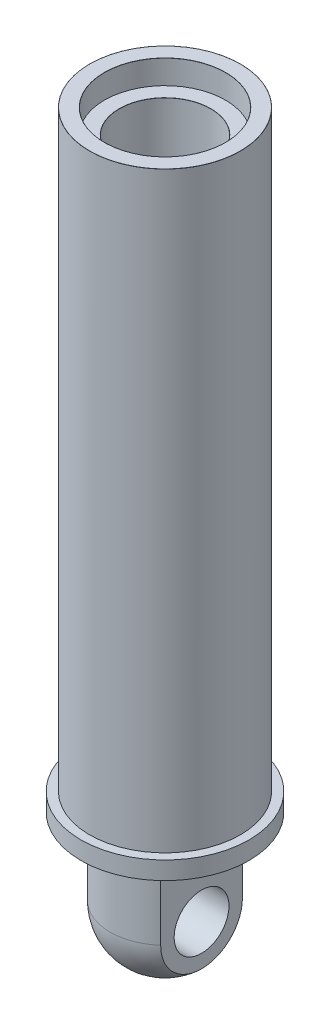
ISO-10303-21;
HEADER;
FILE_DESCRIPTION(('STEP AP214'),'2;1');
FILE_NAME('part.step','',(''),(''),'','','');
FILE_SCHEMA(('AUTOMOTIVE_DESIGN { 1 0 10303 214 1 1 1 1 }'));
ENDSEC;
DATA;
#1=APPLICATION_CONTEXT('core data for automotive mechanical design processes');
#2=APPLICATION_PROTOCOL_DEFINITION('international standard','automotive_design',2000,#1);
#3=PRODUCT_CONTEXT('',#1,'mechanical');
#4=PRODUCT('Part','Part','',(#3));
#5=PRODUCT_RELATED_PRODUCT_CATEGORY('part','',(#4));
#6=PRODUCT_DEFINITION_FORMATION('','',#4);
#7=PRODUCT_DEFINITION_CONTEXT('part definition',#1,'design');
#8=PRODUCT_DEFINITION('design','',#6,#7);
#9=PRODUCT_DEFINITION_SHAPE('','',#8);
#10=(LENGTH_UNIT() NAMED_UNIT(*) SI_UNIT(.MILLI.,.METRE.));
#11=(NAMED_UNIT(*) PLANE_ANGLE_UNIT() SI_UNIT($,.RADIAN.));
#12=(NAMED_UNIT(*) SI_UNIT($,.STERADIAN.) SOLID_ANGLE_UNIT());
#13=UNCERTAINTY_MEASURE_WITH_UNIT(LENGTH_MEASURE(1.E-05),#10,'distance_accuracy_value','');
#14=(GEOMETRIC_REPRESENTATION_CONTEXT(3) GLOBAL_UNCERTAINTY_ASSIGNED_CONTEXT((#13)) GLOBAL_UNIT_ASSIGNED_CONTEXT((#10,
#11,#12)) REPRESENTATION_CONTEXT('',''));
#15=CARTESIAN_POINT('',(0.,0.,0.));
#16=DIRECTION('',(0.,0.,1.));
#17=DIRECTION('',(1.,0.,0.));
#18=AXIS2_PLACEMENT_3D('',#15,#16,#17);
#19=CARTESIAN_POINT('',(0.,22.17,0.));
#20=DIRECTION('',(0.,-1.,0.));
#21=DIRECTION('',(-1.,0.,0.));
#22=AXIS2_PLACEMENT_3D('',#19,#20,#21);
#23=SPHERICAL_SURFACE('',#22,22.17);
#24=CARTESIAN_POINT('',(14.78,22.17,0.));
#25=DIRECTION('',(-1.,0.,0.));
#26=DIRECTION('',(0.,0.,1.));
#27=AXIS2_PLACEMENT_3D('',#24,#25,#26);
#28=CIRCLE('',#27,16.5245423537234);
#29=CARTESIAN_POINT('',(14.78,22.17,16.5245423537236));
#30=VERTEX_POINT('',#29);
#31=CARTESIAN_POINT('',(14.78,22.17,-16.5245423537235));
#32=VERTEX_POINT('',#31);
#33=EDGE_CURVE('E431',#30,#32,#28,.F.);
#34=ORIENTED_EDGE('',*,*,#33,.F.);
#35=CARTESIAN_POINT('',(-4.40612024474978E-13,22.17,0.));
#36=DIRECTION('',(0.,-1.,0.));
#37=DIRECTION('',(1.,0.,0.));
#38=AXIS2_PLACEMENT_3D('',#35,#36,#37);
#39=CIRCLE('',#38,22.1700000000004);
#40=CARTESIAN_POINT('',(-14.78,22.1700000000001,16.5245423537239));
#41=VERTEX_POINT('',#40);
#42=EDGE_CURVE('E109',#30,#41,#39,.T.);
#43=ORIENTED_EDGE('',*,*,#42,.T.);
#44=CARTESIAN_POINT('',(-14.78,22.17,0.));
#45=DIRECTION('',(1.,0.,0.));
#46=DIRECTION('',(0.,0.,-1.));
#47=AXIS2_PLACEMENT_3D('',#44,#45,#46);
#48=CIRCLE('',#47,16.5245423537234);
#49=CARTESIAN_POINT('',(-14.78,22.17,-16.5245423537244));
#50=VERTEX_POINT('',#49);
#51=EDGE_CURVE('E95',#50,#41,#48,.F.);
#52=ORIENTED_EDGE('',*,*,#51,.F.);
#53=EDGE_CURVE('E107',#50,#32,#39,.T.);
#54=ORIENTED_EDGE('',*,*,#53,.T.);
#55=EDGE_LOOP('',(#34,#43,#52,#54));
#56=FACE_BOUND('',#55,.T.);
#57=ADVANCED_FACE('F38',(#56),#23,.T.);
#58=CARTESIAN_POINT('',(-4.75771541383196E-13,0.,0.));
#59=DIRECTION('',(0.,-1.,0.));
#60=DIRECTION('',(1.,0.,0.));
#61=AXIS2_PLACEMENT_3D('',#58,#59,#60);
#62=CYLINDRICAL_SURFACE('',#61,22.1700000000004);
#63=CARTESIAN_POINT('',(-3.91634239195782E-13,53.0531746031747,0.));
#64=DIRECTION('',(0.,-1.,0.));
#65=DIRECTION('',(1.,0.,0.));
#66=AXIS2_PLACEMENT_3D('',#63,#64,#65);
#67=CIRCLE('',#66,22.1700000000004);
#68=CARTESIAN_POINT('',(22.17,53.0531746031746,0.));
#69=VERTEX_POINT('',#68);
#70=EDGE_CURVE('E135',#69,#69,#67,.T.);
#71=ORIENTED_EDGE('',*,*,#70,.T.);
#72=EDGE_LOOP('',(#71));
#73=FACE_BOUND('',#72,.T.);
#74=DIRECTION('',(0.,-1.,0.));
#75=VECTOR('',#74,1.);
#76=CARTESIAN_POINT('',(14.78,0.,-16.5245423537236));
#77=LINE('',#76,#75);
#78=CARTESIAN_POINT('',(14.7800000000001,49.1131746031746,-16.5245423537236));
#79=VERTEX_POINT('',#78);
#80=EDGE_CURVE('E115',#32,#79,#77,.F.);
#81=ORIENTED_EDGE('',*,*,#80,.F.);
#82=ORIENTED_EDGE('',*,*,#53,.F.);
#83=DIRECTION('',(0.,-1.,0.));
#84=VECTOR('',#83,1.);
#85=CARTESIAN_POINT('',(-14.78,0.,-16.5245423537244));
#86=LINE('',#85,#84);
#87=CARTESIAN_POINT('',(-14.7799999999999,49.1131746031746,-16.5245423537244));
#88=VERTEX_POINT('',#87);
#89=EDGE_CURVE('E90',#88,#50,#86,.T.);
#90=ORIENTED_EDGE('',*,*,#89,.F.);
#91=CARTESIAN_POINT('',(-14.78,49.1131746031746,-16.5245423537244));
#92=CARTESIAN_POINT('',(-14.7799891003655,49.1199664546998,-16.5245519764868));
#93=CARTESIAN_POINT('',(-14.7804704950853,49.1267438916265,-16.5241215330274));
#94=CARTESIAN_POINT('',(-14.7823245475202,49.1400248247651,-16.5224629994731));
#95=CARTESIAN_POINT('',(-14.7836904404422,49.1465300044863,-16.5212409635901));
#96=CARTESIAN_POINT('',(-14.787218731554,49.1591158780044,-16.5180830419562));
#97=CARTESIAN_POINT('',(-14.7893793582899,49.1651974803651,-16.5161487438205));
#98=CARTESIAN_POINT('',(-14.7943730063321,49.1768479958101,-16.5116758292743));
#99=CARTESIAN_POINT('',(-14.7972073344631,49.1824158828974,-16.5091360383189));
#100=CARTESIAN_POINT('',(-14.8045263305239,49.1948414846005,-16.5025734914295));
#101=CARTESIAN_POINT('',(-14.8092396864849,49.2014554951328,-16.4983443480468));
#102=CARTESIAN_POINT('',(-14.8193949552396,49.213569413507,-16.4892231474219));
#103=CARTESIAN_POINT('',(-14.8248380192337,49.21906752571,-16.4843300425506));
#104=CARTESIAN_POINT('',(-14.8380834904175,49.230573154955,-16.4724096837897));
#105=CARTESIAN_POINT('',(-14.8460799516037,49.2361712175188,-16.4652037206985));
#106=CARTESIAN_POINT('',(-14.8626293093167,49.2455654227145,-16.4502667157566));
#107=CARTESIAN_POINT('',(-14.8711832486647,49.2493580713446,-16.4425346885879));
#108=CARTESIAN_POINT('',(-14.8875854267982,49.2548926944248,-16.427684185633));
#109=CARTESIAN_POINT('',(-14.8954013803059,49.2568206320836,-16.420597698292));
#110=CARTESIAN_POINT('',(-14.9110902891527,49.2593678626866,-16.4063524241147));
#111=CARTESIAN_POINT('',(-14.9189625795007,49.2599952877061,-16.399194369521));
#112=CARTESIAN_POINT('',(-14.9268253968254,49.26,-16.3920341499375));
#113=B_SPLINE_CURVE_WITH_KNOTS('',3,(#91,#92,#93,#94,#95,#96,#97,#98,#99,#100,#101,#102,#103,
#104,#105,#106,#107,#108,#109,#110,#111,#112),.UNSPECIFIED.,.F.,.F.,(4,2,2,2,2,2,2,2,2,2,4),(0.,
0.0203220730663244,0.0404905263788517,0.0606142941687638,0.0807774206374289,0.108097699029369,
0.135461597040509,0.171667448395586,0.207943086585536,0.240037985163601,0.271931582120744),.UNSPECIFIED.);
#114=CARTESIAN_POINT('',(-14.9268253968254,49.26,-16.3920341499375));
#115=VERTEX_POINT('',#114);
#116=EDGE_CURVE('E182',#88,#115,#113,.T.);
#117=ORIENTED_EDGE('',*,*,#116,.T.);
#118=CARTESIAN_POINT('',(-3.97649854288076E-13,49.26,0.));
#119=DIRECTION('',(0.,1.,0.));
#120=DIRECTION('',(0.,0.,1.));
#121=AXIS2_PLACEMENT_3D('',#118,#119,#120);
#122=CIRCLE('',#121,22.1700000000004);
#123=CARTESIAN_POINT('',(-14.9268253968254,49.26,16.3920341499375));
#124=VERTEX_POINT('',#123);
#125=EDGE_CURVE('E118',#124,#115,#122,.F.);
#126=ORIENTED_EDGE('',*,*,#125,.F.);
#127=CARTESIAN_POINT('',(-14.9268253968254,49.26,16.3920341499375));
#128=CARTESIAN_POINT('',(-14.9176978091646,49.2599921950955,16.4003463103898));
#129=CARTESIAN_POINT('',(-14.908550401604,49.2591475673473,16.4086616950823));
#130=CARTESIAN_POINT('',(-14.890358341048,49.2557048645363,16.425172039319));
#131=CARTESIAN_POINT('',(-14.8813149247991,49.253094040414,16.4333656774792));
#132=CARTESIAN_POINT('',(-14.8642554388219,49.2462934630691,16.4487973343924));
#133=CARTESIAN_POINT('',(-14.8562124582959,49.2422321619367,16.4560615371361));
#134=CARTESIAN_POINT('',(-14.8407062323911,49.2324431153381,16.470046952684));
#135=CARTESIAN_POINT('',(-14.8332415280674,49.2267197489214,16.4767695337952));
#136=CARTESIAN_POINT('',(-14.8209484898026,49.2151564162818,16.4878269233478));
#137=CARTESIAN_POINT('',(-14.8159249430122,49.2096959813371,16.4923408796456));
#138=CARTESIAN_POINT('',(-14.8065802347214,49.1977678108075,16.5007309233203));
#139=CARTESIAN_POINT('',(-14.8022583657921,49.1913011027924,16.5046076531961));
#140=CARTESIAN_POINT('',(-14.7952926414978,49.1787351187304,16.510851987095));
#141=CARTESIAN_POINT('',(-14.7924859816995,49.1727995566587,16.5133663764166));
#142=CARTESIAN_POINT('',(-14.7876410913496,49.1603932902598,16.5177050919051));
#143=CARTESIAN_POINT('',(-14.7856012693573,49.1539237285929,16.5195308472406));
#144=CARTESIAN_POINT('',(-14.7827021963565,49.1417738534388,16.5221251375287));
#145=CARTESIAN_POINT('',(-14.7816981327755,49.1361557363481,16.5230233836966));
#146=CARTESIAN_POINT('',(-14.7803426001115,49.1247530727588,16.5242359233865));
#147=CARTESIAN_POINT('',(-14.7799942616635,49.1189678610875,16.524547415568));
#148=CARTESIAN_POINT('',(-14.78,49.1131746031746,16.5245423537244));
#149=B_SPLINE_CURVE_WITH_KNOTS('',3,(#127,#128,#129,#130,#131,#132,#133,#134,#135,#136,#137,
#138,#139,#140,#141,#142,#143,#144,#145,#146,#147,#148),.UNSPECIFIED.,.F.,.F.,(4,2,2,2,2,2,2,2,
2,2,4),(0.,0.0370353010069226,0.0743408300476432,0.108936819133006,0.143442472430143,
0.169407030649199,0.195345246719387,0.21635423514732,0.23731937910451,0.254584774260744,
0.27193239273483),.UNSPECIFIED.);
#150=CARTESIAN_POINT('',(-14.7799999999999,49.1131746031746,16.5245423537244));
#151=VERTEX_POINT('',#150);
#152=EDGE_CURVE('E177',#124,#151,#149,.T.);
#153=ORIENTED_EDGE('',*,*,#152,.T.);
#154=DIRECTION('',(0.,-1.,0.));
#155=VECTOR('',#154,1.);
#156=CARTESIAN_POINT('',(-14.78,0.,16.5245423537244));
#157=LINE('',#156,#155);
#158=EDGE_CURVE('E110',#41,#151,#157,.F.);
#159=ORIENTED_EDGE('',*,*,#158,.F.);
#160=ORIENTED_EDGE('',*,*,#42,.F.);
#161=DIRECTION('',(0.,-1.,0.));
#162=VECTOR('',#161,1.);
#163=CARTESIAN_POINT('',(14.78,0.,16.5245423537236));
#164=LINE('',#163,#162);
#165=CARTESIAN_POINT('',(14.7800000000001,49.1131746031746,16.5245423537236));
#166=VERTEX_POINT('',#165);
#167=EDGE_CURVE('E130',#166,#30,#164,.T.);
#168=ORIENTED_EDGE('',*,*,#167,.F.);
#169=CARTESIAN_POINT('',(14.78,49.1131746031746,16.5245423537236));
#170=CARTESIAN_POINT('',(14.7799891003655,49.1199664546998,16.5245519764861));
#171=CARTESIAN_POINT('',(14.7804704950853,49.1267438916265,16.5241215330266));
#172=CARTESIAN_POINT('',(14.7823245475202,49.1400248247651,16.5224629994724));
#173=CARTESIAN_POINT('',(14.7836904404422,49.1465300044863,16.5212409635893));
#174=CARTESIAN_POINT('',(14.787218731554,49.1591158780044,16.5180830419554));
#175=CARTESIAN_POINT('',(14.7893793582899,49.1651974803651,16.5161487438198));
#176=CARTESIAN_POINT('',(14.7943730063321,49.1768479958101,16.5116758292736));
#177=CARTESIAN_POINT('',(14.7972073344631,49.1824158828973,16.5091360383182));
#178=CARTESIAN_POINT('',(14.8045263305239,49.1948414846005,16.5025734914288));
#179=CARTESIAN_POINT('',(14.8092396864849,49.2014554951328,16.4983443480461));
#180=CARTESIAN_POINT('',(14.8193949552396,49.213569413507,16.4892231474212));
#181=CARTESIAN_POINT('',(14.8248380192337,49.21906752571,16.4843300425498));
#182=CARTESIAN_POINT('',(14.8380834904175,49.230573154955,16.472409683789));
#183=CARTESIAN_POINT('',(14.8460799516037,49.2361712175188,16.4652037206978));
#184=CARTESIAN_POINT('',(14.8626293093167,49.2455654227145,16.4502667157559));
#185=CARTESIAN_POINT('',(14.8711832486647,49.2493580713446,16.4425346885872));
#186=CARTESIAN_POINT('',(14.8875854267982,49.2548926944248,16.4276841856323));
#187=CARTESIAN_POINT('',(14.8954013803059,49.2568206320836,16.4205976982913));
#188=CARTESIAN_POINT('',(14.9110902891527,49.2593678626866,16.4063524241139));
#189=CARTESIAN_POINT('',(14.9189625795007,49.2599952877061,16.3991943695203));
#190=CARTESIAN_POINT('',(14.9268253968254,49.26,16.3920341499368));
#191=B_SPLINE_CURVE_WITH_KNOTS('',3,(#169,#170,#171,#172,#173,#174,#175,#176,#177,#178,#179,
#180,#181,#182,#183,#184,#185,#186,#187,#188,#189,#190),.UNSPECIFIED.,.F.,.F.,(4,2,2,2,2,2,2,2,
2,2,4),(0.,0.0203220730663302,0.0404905263788419,0.0606142941687467,0.0807774206374151,
0.10809769902936,0.135461597040501,0.171667448395588,0.207943086585534,0.240037985163602,
0.271931582120741),.UNSPECIFIED.);
#192=CARTESIAN_POINT('',(14.9268253968254,49.26,16.3920341499368));
#193=VERTEX_POINT('',#192);
#194=EDGE_CURVE('E53',#166,#193,#191,.T.);
#195=ORIENTED_EDGE('',*,*,#194,.T.);
#196=CARTESIAN_POINT('',(-3.97649854288076E-13,49.26,0.));
#197=DIRECTION('',(0.,1.,0.));
#198=DIRECTION('',(0.,0.,1.));
#199=AXIS2_PLACEMENT_3D('',#196,#197,#198);
#200=CIRCLE('',#199,22.1700000000004);
#201=CARTESIAN_POINT('',(14.9268253968254,49.26,-16.3920341499368));
#202=VERTEX_POINT('',#201);
#203=EDGE_CURVE('E133',#202,#193,#200,.F.);
#204=ORIENTED_EDGE('',*,*,#203,.F.);
#205=CARTESIAN_POINT('',(14.9268253968254,49.26,-16.3920341499368));
#206=CARTESIAN_POINT('',(14.9176978091646,49.2599921950955,-16.4003463103891));
#207=CARTESIAN_POINT('',(14.908550401604,49.2591475673473,-16.4086616950816));
#208=CARTESIAN_POINT('',(14.890358341048,49.2557048645363,-16.4251720393182));
#209=CARTESIAN_POINT('',(14.8813149247991,49.253094040414,-16.4333656774785));
#210=CARTESIAN_POINT('',(14.8642554388219,49.2462934630691,-16.4487973343917));
#211=CARTESIAN_POINT('',(14.8562124582959,49.2422321619367,-16.4560615371354));
#212=CARTESIAN_POINT('',(14.8407062323911,49.2324431153381,-16.4700469526833));
#213=CARTESIAN_POINT('',(14.8332415280674,49.2267197489214,-16.4767695337944));
#214=CARTESIAN_POINT('',(14.8209484898026,49.2151564162818,-16.4878269233471));
#215=CARTESIAN_POINT('',(14.8159249430122,49.2096959813371,-16.4923408796449));
#216=CARTESIAN_POINT('',(14.8065802347214,49.1977678108075,-16.5007309233196));
#217=CARTESIAN_POINT('',(14.8022583657921,49.1913011027924,-16.5046076531953));
#218=CARTESIAN_POINT('',(14.7952926414978,49.1787351187304,-16.5108519870943));
#219=CARTESIAN_POINT('',(14.7924859816995,49.1727995566587,-16.5133663764159));
#220=CARTESIAN_POINT('',(14.7876410913496,49.1603932902598,-16.5177050919044));
#221=CARTESIAN_POINT('',(14.7856012693573,49.1539237285929,-16.5195308472399));
#222=CARTESIAN_POINT('',(14.7827021963565,49.1417738534388,-16.522125137528));
#223=CARTESIAN_POINT('',(14.7816981327755,49.1361557363481,-16.5230233836959));
#224=CARTESIAN_POINT('',(14.7803426001115,49.1247530727589,-16.5242359233858));
#225=CARTESIAN_POINT('',(14.7799942616635,49.1189678610875,-16.5245474155673));
#226=CARTESIAN_POINT('',(14.78,49.1131746031746,-16.5245423537236));
#227=B_SPLINE_CURVE_WITH_KNOTS('',3,(#205,#206,#207,#208,#209,#210,#211,#212,#213,#214,#215,
#216,#217,#218,#219,#220,#221,#222,#223,#224,#225,#226),.UNSPECIFIED.,.F.,.F.,(4,2,2,2,2,2,2,2,
2,2,4),(0.,0.0370353010069213,0.074340830047643,0.108936819133009,0.143442472430147,
0.169407030649203,0.195345246719393,0.216354235147319,0.237319379104524,0.254584774260744,
0.271932392734809),.UNSPECIFIED.);
#228=EDGE_CURVE('E156',#202,#79,#227,.T.);
#229=ORIENTED_EDGE('',*,*,#228,.T.);
#230=EDGE_LOOP('',(#81,#82,#90,#117,#126,#153,#159,#160,#168,#195,#204,#229));
#231=FACE_BOUND('',#230,.T.);
#232=ADVANCED_FACE('F113',(#73,#231),#62,.T.);
#233=CARTESIAN_POINT('',(0.,53.2,0.));
#234=DIRECTION('',(0.,-1.,0.));
#235=DIRECTION('',(1.,0.,0.));
#236=AXIS2_PLACEMENT_3D('',#233,#234,#235);
#237=PLANE('',#236);
#238=CARTESIAN_POINT('',(-3.91401388044576E-13,53.2,0.));
#239=DIRECTION('',(0.,-1.,0.));
#240=DIRECTION('',(1.,0.,0.));
#241=AXIS2_PLACEMENT_3D('',#238,#239,#240);
#242=CIRCLE('',#241,22.3168253968258);
#243=CARTESIAN_POINT('',(22.3168253968254,53.2,0.));
#244=VERTEX_POINT('',#243);
#245=EDGE_CURVE('E138',#244,#244,#242,.F.);
#246=ORIENTED_EDGE('',*,*,#245,.T.);
#247=EDGE_LOOP('',(#246));
#248=FACE_BOUND('',#247,.T.);
#249=CARTESIAN_POINT('',(-3.91401388044576E-13,53.2000000000001,0.));
#250=DIRECTION('',(0.,-1.,0.));
#251=DIRECTION('',(1.,0.,0.));
#252=AXIS2_PLACEMENT_3D('',#249,#250,#251);
#253=CIRCLE('',#252,34.0100000000004);
#254=CARTESIAN_POINT('',(34.01,53.2,0.));
#255=VERTEX_POINT('',#254);
#256=EDGE_CURVE('E116',#255,#255,#253,.T.);
#257=ORIENTED_EDGE('',*,*,#256,.T.);
#258=EDGE_LOOP('',(#257));
#259=FACE_BOUND('',#258,.T.);
#260=ADVANCED_FACE('F170',(#248,#259),#237,.T.);
#261=CARTESIAN_POINT('',(-4.75771541383196E-13,0.,0.));
#262=DIRECTION('',(0.,-1.,0.));
#263=DIRECTION('',(1.,0.,0.));
#264=AXIS2_PLACEMENT_3D('',#261,#262,#263);
#265=CYLINDRICAL_SURFACE('',#264,34.0100000000004);
#266=CARTESIAN_POINT('',(-3.79919434845862E-13,60.4400000000001,0.));
#267=DIRECTION('',(0.,-1.,0.));
#268=DIRECTION('',(1.,0.,0.));
#269=AXIS2_PLACEMENT_3D('',#266,#267,#268);
#270=CIRCLE('',#269,34.0100000000004);
#271=CARTESIAN_POINT('',(34.01,60.44,0.));
#272=VERTEX_POINT('',#271);
#273=EDGE_CURVE('E120',#272,#272,#270,.T.);
#274=ORIENTED_EDGE('',*,*,#273,.T.);
#275=EDGE_LOOP('',(#274));
#276=FACE_BOUND('',#275,.T.);
#277=ORIENTED_EDGE('',*,*,#256,.F.);
#278=EDGE_LOOP('',(#277));
#279=FACE_BOUND('',#278,.T.);
#280=ADVANCED_FACE('F223',(#276,#279),#265,.T.);
#281=CARTESIAN_POINT('',(0.,60.4400000000001,0.));
#282=DIRECTION('',(0.,1.,0.));
#283=DIRECTION('',(-1.,0.,0.));
#284=AXIS2_PLACEMENT_3D('',#281,#282,#283);
#285=PLANE('',#284);
#286=CARTESIAN_POINT('',(-3.79919434845862E-13,60.4400000000001,0.));
#287=DIRECTION('',(0.,-1.,0.));
#288=DIRECTION('',(1.,0.,0.));
#289=AXIS2_PLACEMENT_3D('',#286,#287,#288);
#290=CIRCLE('',#289,30.5000000000004);
#291=CARTESIAN_POINT('',(30.5,60.44,0.));
#292=VERTEX_POINT('',#291);
#293=EDGE_CURVE('E427',#292,#292,#290,.T.);
#294=ORIENTED_EDGE('',*,*,#293,.T.);
#295=EDGE_LOOP('',(#294));
#296=FACE_BOUND('',#295,.T.);
#297=ORIENTED_EDGE('',*,*,#273,.F.);
#298=EDGE_LOOP('',(#297));
#299=FACE_BOUND('',#298,.T.);
#300=ADVANCED_FACE('F231',(#296,#299),#285,.T.);
#301=CARTESIAN_POINT('',(-4.75771541383196E-13,0.,0.));
#302=DIRECTION('',(0.,-1.,0.));
#303=DIRECTION('',(1.,0.,0.));
#304=AXIS2_PLACEMENT_3D('',#301,#302,#303);
#305=CYLINDRICAL_SURFACE('',#304,30.5000000000002);
#306=CARTESIAN_POINT('',(0.,299.955952380952,0.));
#307=DIRECTION('',(0.,1.,0.));
#308=DIRECTION('',(-1.,0.,0.));
#309=AXIS2_PLACEMENT_3D('',#306,#307,#308);
#310=CIRCLE('',#309,30.5000000000002);
#311=CARTESIAN_POINT('',(-30.5000000000002,299.955952380952,0.));
#312=VERTEX_POINT('',#311);
#313=EDGE_CURVE('E449',#312,#312,#310,.F.);
#314=ORIENTED_EDGE('',*,*,#313,.T.);
#315=EDGE_LOOP('',(#314));
#316=FACE_BOUND('',#315,.T.);
#317=ORIENTED_EDGE('',*,*,#293,.F.);
#318=EDGE_LOOP('',(#317));
#319=FACE_BOUND('',#318,.T.);
#320=ADVANCED_FACE('F238',(#316,#319),#305,.T.);
#321=CARTESIAN_POINT('',(0.,300.,0.));
#322=DIRECTION('',(0.,1.,0.));
#323=DIRECTION('',(-1.,0.,0.));
#324=AXIS2_PLACEMENT_3D('',#321,#322,#323);
#325=PLANE('',#324);
#326=CARTESIAN_POINT('',(0.,300.,0.));
#327=DIRECTION('',(0.,1.,0.));
#328=DIRECTION('',(-1.,0.,0.));
#329=AXIS2_PLACEMENT_3D('',#326,#327,#328);
#330=CIRCLE('',#329,30.4559523809526);
#331=CARTESIAN_POINT('',(-30.4559523809526,300.,0.));
#332=VERTEX_POINT('',#331);
#333=EDGE_CURVE('E454',#332,#332,#330,.T.);
#334=ORIENTED_EDGE('',*,*,#333,.T.);
#335=EDGE_LOOP('',(#334));
#336=FACE_BOUND('',#335,.T.);
#337=CARTESIAN_POINT('',(4.71650854030542E-13,300.,0.));
#338=DIRECTION('',(0.,1.,0.));
#339=DIRECTION('',(-1.,0.,0.));
#340=AXIS2_PLACEMENT_3D('',#337,#338,#339);
#341=CIRCLE('',#340,24.5440476190476);
#342=CARTESIAN_POINT('',(-24.5440476190471,300.,0.));
#343=VERTEX_POINT('',#342);
#344=EDGE_CURVE('E451',#343,#343,#341,.F.);
#345=ORIENTED_EDGE('',*,*,#344,.T.);
#346=EDGE_LOOP('',(#345));
#347=FACE_BOUND('',#346,.T.);
#348=ADVANCED_FACE('F246',(#336,#347),#325,.T.);
#349=CARTESIAN_POINT('',(-14.78,28.1481481481481,-34.0100000000004));
#350=DIRECTION('',(1.,0.,0.));
#351=DIRECTION('',(0.,0.,-1.));
#352=AXIS2_PLACEMENT_3D('',#349,#350,#351);
#353=PLANE('',#352);
#354=ORIENTED_EDGE('',*,*,#158,.T.);
#355=DIRECTION('',(0.,0.,1.));
#356=VECTOR('',#355,1.);
#357=CARTESIAN_POINT('',(-14.78,49.1131746031746,-16.5245423537244));
#358=LINE('',#357,#356);
#359=EDGE_CURVE('E98',#151,#88,#358,.F.);
#360=ORIENTED_EDGE('',*,*,#359,.T.);
#361=ORIENTED_EDGE('',*,*,#89,.T.);
#362=ORIENTED_EDGE('',*,*,#51,.T.);
#363=EDGE_LOOP('',(#354,#360,#361,#362));
#364=FACE_BOUND('',#363,.T.);
#365=CARTESIAN_POINT('',(-14.78,22.17,0.));
#366=DIRECTION('',(1.,0.,0.));
#367=DIRECTION('',(0.,0.,-1.));
#368=AXIS2_PLACEMENT_3D('',#365,#366,#367);
#369=CIRCLE('',#368,11.085);
#370=CARTESIAN_POINT('',(-14.78,22.17,-11.085));
#371=VERTEX_POINT('',#370);
#372=EDGE_CURVE('E101',#371,#371,#369,.F.);
#373=ORIENTED_EDGE('',*,*,#372,.F.);
#374=EDGE_LOOP('',(#373));
#375=FACE_BOUND('',#374,.T.);
#376=ADVANCED_FACE('F93',(#364,#375),#353,.F.);
#377=CARTESIAN_POINT('',(-35.8888888888889,49.26,-34.0100000000004));
#378=DIRECTION('',(0.,1.,0.));
#379=DIRECTION('',(0.,0.,1.));
#380=AXIS2_PLACEMENT_3D('',#377,#378,#379);
#381=PLANE('',#380);
#382=ORIENTED_EDGE('',*,*,#125,.T.);
#383=DIRECTION('',(0.,0.,1.));
#384=VECTOR('',#383,1.);
#385=CARTESIAN_POINT('',(-14.9268253968254,49.26,16.5245423537244));
#386=LINE('',#385,#384);
#387=EDGE_CURVE('E145',#115,#124,#386,.T.);
#388=ORIENTED_EDGE('',*,*,#387,.T.);
#389=EDGE_LOOP('',(#382,#388));
#390=FACE_BOUND('',#389,.T.);
#391=ADVANCED_FACE('F261',(#390),#381,.F.);
#392=CARTESIAN_POINT('',(14.78,0.,-34.0100000000004));
#393=DIRECTION('',(-1.,0.,0.));
#394=DIRECTION('',(0.,0.,1.));
#395=AXIS2_PLACEMENT_3D('',#392,#393,#394);
#396=PLANE('',#395);
#397=ORIENTED_EDGE('',*,*,#80,.T.);
#398=DIRECTION('',(0.,0.,1.));
#399=VECTOR('',#398,1.);
#400=CARTESIAN_POINT('',(14.78,49.1131746031746,16.5245423537236));
#401=LINE('',#400,#399);
#402=EDGE_CURVE('E141',#79,#166,#401,.T.);
#403=ORIENTED_EDGE('',*,*,#402,.T.);
#404=ORIENTED_EDGE('',*,*,#167,.T.);
#405=ORIENTED_EDGE('',*,*,#33,.T.);
#406=EDGE_LOOP('',(#397,#403,#404,#405));
#407=FACE_BOUND('',#406,.T.);
#408=CARTESIAN_POINT('',(14.78,22.17,0.));
#409=DIRECTION('',(-1.,0.,0.));
#410=DIRECTION('',(0.,0.,1.));
#411=AXIS2_PLACEMENT_3D('',#408,#409,#410);
#412=CIRCLE('',#411,11.085);
#413=CARTESIAN_POINT('',(14.78,22.17,11.085));
#414=VERTEX_POINT('',#413);
#415=EDGE_CURVE('E127',#414,#414,#412,.F.);
#416=ORIENTED_EDGE('',*,*,#415,.F.);
#417=EDGE_LOOP('',(#416));
#418=FACE_BOUND('',#417,.T.);
#419=ADVANCED_FACE('F268',(#407,#418),#396,.F.);
#420=CARTESIAN_POINT('',(14.78,49.26,-34.0100000000004));
#421=DIRECTION('',(0.,1.,0.));
#422=DIRECTION('',(0.,0.,1.));
#423=AXIS2_PLACEMENT_3D('',#420,#421,#422);
#424=PLANE('',#423);
#425=ORIENTED_EDGE('',*,*,#203,.T.);
#426=DIRECTION('',(0.,0.,1.));
#427=VECTOR('',#426,1.);
#428=CARTESIAN_POINT('',(14.9268253968254,49.26,-16.5245423537236));
#429=LINE('',#428,#427);
#430=EDGE_CURVE('E59',#193,#202,#429,.F.);
#431=ORIENTED_EDGE('',*,*,#430,.T.);
#432=EDGE_LOOP('',(#425,#431));
#433=FACE_BOUND('',#432,.T.);
#434=ADVANCED_FACE('F276',(#433),#424,.F.);
#435=CARTESIAN_POINT('',(-34.0100000000008,22.17,0.));
#436=DIRECTION('',(1.,0.,0.));
#437=DIRECTION('',(0.,0.,-1.));
#438=AXIS2_PLACEMENT_3D('',#435,#436,#437);
#439=CYLINDRICAL_SURFACE('',#438,11.085);
#440=ORIENTED_EDGE('',*,*,#415,.T.);
#441=EDGE_LOOP('',(#440));
#442=FACE_BOUND('',#441,.T.);
#443=ORIENTED_EDGE('',*,*,#372,.T.);
#444=EDGE_LOOP('',(#443));
#445=FACE_BOUND('',#444,.T.);
#446=ADVANCED_FACE('F284',(#442,#445),#439,.F.);
#447=CARTESIAN_POINT('',(-3.91634239195782E-13,53.0531746031747,0.));
#448=DIRECTION('',(0.,-1.,0.));
#449=DIRECTION('',(1.,0.,0.));
#450=AXIS2_PLACEMENT_3D('',#447,#448,#449);
#451=TOROIDAL_SURFACE('',#450,22.3168253968258,0.146825396825397);
#452=ORIENTED_EDGE('',*,*,#245,.F.);
#453=EDGE_LOOP('',(#452));
#454=FACE_BOUND('',#453,.T.);
#455=ORIENTED_EDGE('',*,*,#70,.F.);
#456=EDGE_LOOP('',(#455));
#457=FACE_BOUND('',#456,.T.);
#458=ADVANCED_FACE('F291',(#454,#457),#451,.F.);
#459=CARTESIAN_POINT('',(14.9268253968254,49.1131746031746,-34.0100000000004));
#460=DIRECTION('',(0.,0.,-1.));
#461=DIRECTION('',(-1.,0.,0.));
#462=AXIS2_PLACEMENT_3D('',#459,#460,#461);
#463=CYLINDRICAL_SURFACE('',#462,0.146825396825397);
#464=ORIENTED_EDGE('',*,*,#228,.F.);
#465=ORIENTED_EDGE('',*,*,#430,.F.);
#466=ORIENTED_EDGE('',*,*,#194,.F.);
#467=ORIENTED_EDGE('',*,*,#402,.F.);
#468=EDGE_LOOP('',(#464,#465,#466,#467));
#469=FACE_BOUND('',#468,.T.);
#470=ADVANCED_FACE('F162',(#469),#463,.F.);
#471=CARTESIAN_POINT('',(-14.9268253968254,49.1131746031746,-34.0100000000004));
#472=DIRECTION('',(0.,0.,-1.));
#473=DIRECTION('',(-1.,0.,0.));
#474=AXIS2_PLACEMENT_3D('',#471,#472,#473);
#475=CYLINDRICAL_SURFACE('',#474,0.146825396825397);
#476=ORIENTED_EDGE('',*,*,#116,.F.);
#477=ORIENTED_EDGE('',*,*,#359,.F.);
#478=ORIENTED_EDGE('',*,*,#152,.F.);
#479=ORIENTED_EDGE('',*,*,#387,.F.);
#480=EDGE_LOOP('',(#476,#477,#478,#479));
#481=FACE_BOUND('',#480,.T.);
#482=ADVANCED_FACE('F188',(#481),#475,.F.);
#483=CARTESIAN_POINT('',(4.71218596820842E-13,290.309523809263,0.));
#484=DIRECTION('',(0.,1.,0.));
#485=DIRECTION('',(-1.,0.,0.));
#486=AXIS2_PLACEMENT_3D('',#483,#484,#485);
#487=CYLINDRICAL_SURFACE('',#486,24.5);
#488=CARTESIAN_POINT('',(4.7158099868518E-13,299.955952380952,0.));
#489=DIRECTION('',(0.,1.,0.));
#490=DIRECTION('',(-1.,0.,0.));
#491=AXIS2_PLACEMENT_3D('',#488,#489,#490);
#492=CIRCLE('',#491,24.5);
#493=CARTESIAN_POINT('',(-24.4999999999995,299.955952380952,0.));
#494=VERTEX_POINT('',#493);
#495=EDGE_CURVE('E459',#494,#494,#492,.T.);
#496=ORIENTED_EDGE('',*,*,#495,.T.);
#497=EDGE_LOOP('',(#496));
#498=FACE_BOUND('',#497,.T.);
#499=CARTESIAN_POINT('',(4.71218596820842E-13,290.309523809263,0.));
#500=DIRECTION('',(0.,1.,0.));
#501=DIRECTION('',(-1.,0.,0.));
#502=AXIS2_PLACEMENT_3D('',#499,#500,#501);
#503=CIRCLE('',#502,24.5);
#504=CARTESIAN_POINT('',(-24.4999999999995,290.309523809263,0.));
#505=VERTEX_POINT('',#504);
#506=EDGE_CURVE('E126',#505,#505,#503,.T.);
#507=ORIENTED_EDGE('',*,*,#506,.F.);
#508=EDGE_LOOP('',(#507));
#509=FACE_BOUND('',#508,.T.);
#510=ADVANCED_FACE('F192',(#498,#509),#487,.F.);
#511=CARTESIAN_POINT('',(4.71218596820842E-13,290.309523809263,0.));
#512=DIRECTION('',(0.,1.,0.));
#513=DIRECTION('',(-1.,0.,0.));
#514=AXIS2_PLACEMENT_3D('',#511,#512,#513);
#515=PLANE('',#514);
#516=CARTESIAN_POINT('',(0.,290.309523809263,0.));
#517=DIRECTION('',(0.,1.,0.));
#518=DIRECTION('',(-1.,0.,0.));
#519=AXIS2_PLACEMENT_3D('',#516,#517,#518);
#520=CIRCLE('',#519,18.5440476190478);
#521=CARTESIAN_POINT('',(-18.5440476190478,290.309523809263,0.));
#522=VERTEX_POINT('',#521);
#523=EDGE_CURVE('E11',#522,#522,#520,.F.);
#524=ORIENTED_EDGE('',*,*,#523,.T.);
#525=EDGE_LOOP('',(#524));
#526=FACE_BOUND('',#525,.T.);
#527=ORIENTED_EDGE('',*,*,#506,.T.);
#528=EDGE_LOOP('',(#527));
#529=FACE_BOUND('',#528,.T.);
#530=ADVANCED_FACE('F313',(#526,#529),#515,.T.);
#531=CARTESIAN_POINT('',(0.,60.44,0.));
#532=DIRECTION('',(0.,1.,0.));
#533=DIRECTION('',(-1.,0.,0.));
#534=AXIS2_PLACEMENT_3D('',#531,#532,#533);
#535=PLANE('',#534);
#536=CARTESIAN_POINT('',(-3.79919434845862E-13,60.44,0.));
#537=DIRECTION('',(0.,-1.,0.));
#538=DIRECTION('',(1.,0.,0.));
#539=AXIS2_PLACEMENT_3D('',#536,#537,#538);
#540=CIRCLE('',#539,18.5000000000004);
#541=CARTESIAN_POINT('',(18.5,60.44,0.));
#542=VERTEX_POINT('',#541);
#543=EDGE_CURVE('E426',#542,#542,#540,.T.);
#544=ORIENTED_EDGE('',*,*,#543,.F.);
#545=EDGE_LOOP('',(#544));
#546=FACE_BOUND('',#545,.T.);
#547=ADVANCED_FACE('F321',(#546),#535,.T.);
#548=CARTESIAN_POINT('',(-4.75771541383196E-13,0.,0.));
#549=DIRECTION('',(0.,-1.,0.));
#550=DIRECTION('',(1.,0.,0.));
#551=AXIS2_PLACEMENT_3D('',#548,#549,#550);
#552=CYLINDRICAL_SURFACE('',#551,18.5000000000002);
#553=CARTESIAN_POINT('',(0.,290.265476190215,0.));
#554=DIRECTION('',(0.,1.,0.));
#555=DIRECTION('',(-1.,0.,0.));
#556=AXIS2_PLACEMENT_3D('',#553,#554,#555);
#557=CIRCLE('',#556,18.5000000000002);
#558=CARTESIAN_POINT('',(-18.5000000000002,290.265476190215,0.));
#559=VERTEX_POINT('',#558);
#560=EDGE_CURVE('E46',#559,#559,#557,.T.);
#561=ORIENTED_EDGE('',*,*,#560,.T.);
#562=EDGE_LOOP('',(#561));
#563=FACE_BOUND('',#562,.T.);
#564=ORIENTED_EDGE('',*,*,#543,.T.);
#565=EDGE_LOOP('',(#564));
#566=FACE_BOUND('',#565,.T.);
#567=ADVANCED_FACE('F198',(#563,#566),#552,.F.);
#568=CARTESIAN_POINT('',(0.,299.955952380952,0.));
#569=DIRECTION('',(0.,1.,0.));
#570=DIRECTION('',(-1.,0.,0.));
#571=AXIS2_PLACEMENT_3D('',#568,#569,#570);
#572=TOROIDAL_SURFACE('',#571,30.4559523809526,0.0440476190476191);
#573=ORIENTED_EDGE('',*,*,#333,.F.);
#574=EDGE_LOOP('',(#573));
#575=FACE_BOUND('',#574,.T.);
#576=ORIENTED_EDGE('',*,*,#313,.F.);
#577=EDGE_LOOP('',(#576));
#578=FACE_BOUND('',#577,.T.);
#579=ADVANCED_FACE('F194',(#575,#578),#572,.T.);
#580=CARTESIAN_POINT('',(4.7158099868518E-13,299.955952380952,0.));
#581=DIRECTION('',(0.,1.,0.));
#582=DIRECTION('',(-1.,0.,0.));
#583=AXIS2_PLACEMENT_3D('',#580,#581,#582);
#584=TOROIDAL_SURFACE('',#583,24.5440476190476,0.0440476190476191);
#585=ORIENTED_EDGE('',*,*,#344,.F.);
#586=EDGE_LOOP('',(#585));
#587=FACE_BOUND('',#586,.T.);
#588=ORIENTED_EDGE('',*,*,#495,.F.);
#589=EDGE_LOOP('',(#588));
#590=FACE_BOUND('',#589,.T.);
#591=ADVANCED_FACE('F197',(#587,#590),#584,.T.);
#592=CARTESIAN_POINT('',(0.,290.265476190215,0.));
#593=DIRECTION('',(0.,1.,0.));
#594=DIRECTION('',(-1.,0.,0.));
#595=AXIS2_PLACEMENT_3D('',#592,#593,#594);
#596=TOROIDAL_SURFACE('',#595,18.5440476190478,0.0440476190476191);
#597=ORIENTED_EDGE('',*,*,#523,.F.);
#598=EDGE_LOOP('',(#597));
#599=FACE_BOUND('',#598,.T.);
#600=ORIENTED_EDGE('',*,*,#560,.F.);
#601=EDGE_LOOP('',(#600));
#602=FACE_BOUND('',#601,.T.);
#603=ADVANCED_FACE('F40',(#599,#602),#596,.T.);
#604=CLOSED_SHELL('',(#57,#232,#260,#280,#300,#320,#348,#376,#391,#419,#434,#446,#458,#470,#482,
#510,#530,#547,#567,#579,#591,#603));
#605=MANIFOLD_SOLID_BREP('B2',#604);
#606=ADVANCED_BREP_SHAPE_REPRESENTATION('',(#18,#605),#14);
#607=SHAPE_DEFINITION_REPRESENTATION(#9,#606);
ENDSEC;
END-ISO-10303-21;
